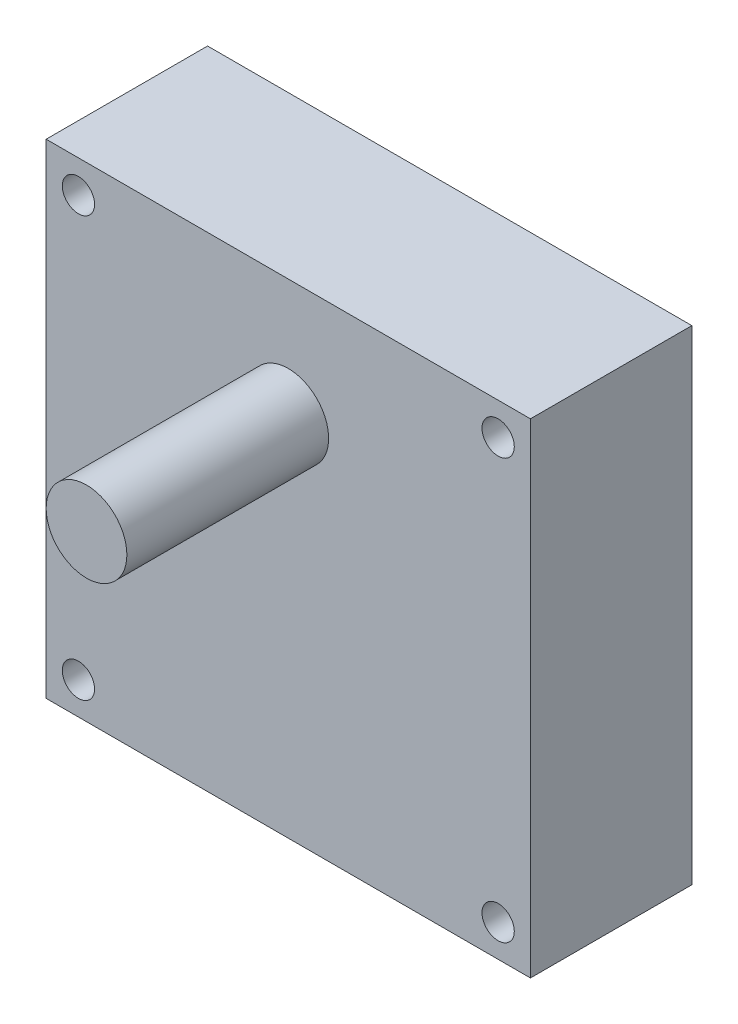
ISO-10303-21;
HEADER;
FILE_DESCRIPTION(('STEP AP214'),'2;1');
FILE_NAME('part.step','',(''),(''),'','','');
FILE_SCHEMA(('AUTOMOTIVE_DESIGN { 1 0 10303 214 1 1 1 1 }'));
ENDSEC;
DATA;
#1=APPLICATION_CONTEXT('core data for automotive mechanical design processes');
#2=APPLICATION_PROTOCOL_DEFINITION('international standard','automotive_design',2000,#1);
#3=PRODUCT_CONTEXT('',#1,'mechanical');
#4=PRODUCT('Part','Part','',(#3));
#5=PRODUCT_RELATED_PRODUCT_CATEGORY('part','',(#4));
#6=PRODUCT_DEFINITION_FORMATION('','',#4);
#7=PRODUCT_DEFINITION_CONTEXT('part definition',#1,'design');
#8=PRODUCT_DEFINITION('design','',#6,#7);
#9=PRODUCT_DEFINITION_SHAPE('','',#8);
#10=(LENGTH_UNIT() NAMED_UNIT(*) SI_UNIT(.MILLI.,.METRE.));
#11=(NAMED_UNIT(*) PLANE_ANGLE_UNIT() SI_UNIT($,.RADIAN.));
#12=(NAMED_UNIT(*) SI_UNIT($,.STERADIAN.) SOLID_ANGLE_UNIT());
#13=UNCERTAINTY_MEASURE_WITH_UNIT(LENGTH_MEASURE(1.E-05),#10,'distance_accuracy_value','');
#14=(GEOMETRIC_REPRESENTATION_CONTEXT(3) GLOBAL_UNCERTAINTY_ASSIGNED_CONTEXT((#13)) GLOBAL_UNIT_ASSIGNED_CONTEXT((#10,
#11,#12)) REPRESENTATION_CONTEXT('',''));
#15=CARTESIAN_POINT('',(0.,0.,0.));
#16=DIRECTION('',(0.,0.,1.));
#17=DIRECTION('',(1.,0.,0.));
#18=AXIS2_PLACEMENT_3D('',#15,#16,#17);
#19=CARTESIAN_POINT('',(0.,0.,20.));
#20=DIRECTION('',(-1.,0.,0.));
#21=DIRECTION('',(0.,-1.,0.));
#22=AXIS2_PLACEMENT_3D('',#19,#20,#21);
#23=PLANE('',#22);
#24=DIRECTION('',(0.,1.,0.));
#25=VECTOR('',#24,1.);
#26=CARTESIAN_POINT('',(0.,0.,0.));
#27=LINE('',#26,#25);
#28=CARTESIAN_POINT('',(0.,-60.,0.));
#29=VERTEX_POINT('',#28);
#30=CARTESIAN_POINT('',(0.,0.,0.));
#31=VERTEX_POINT('',#30);
#32=EDGE_CURVE('E100',#29,#31,#27,.T.);
#33=ORIENTED_EDGE('',*,*,#32,.T.);
#34=DIRECTION('',(0.,0.,-1.));
#35=VECTOR('',#34,1.);
#36=CARTESIAN_POINT('',(0.,0.,20.));
#37=LINE('',#36,#35);
#38=CARTESIAN_POINT('',(0.,0.,20.));
#39=VERTEX_POINT('',#38);
#40=EDGE_CURVE('E42',#39,#31,#37,.T.);
#41=ORIENTED_EDGE('',*,*,#40,.F.);
#42=DIRECTION('',(0.,1.,0.));
#43=VECTOR('',#42,1.);
#44=CARTESIAN_POINT('',(0.,0.,20.));
#45=LINE('',#44,#43);
#46=CARTESIAN_POINT('',(0.,-60.,20.));
#47=VERTEX_POINT('',#46);
#48=EDGE_CURVE('E86',#47,#39,#45,.T.);
#49=ORIENTED_EDGE('',*,*,#48,.F.);
#50=DIRECTION('',(0.,0.,-1.));
#51=VECTOR('',#50,1.);
#52=CARTESIAN_POINT('',(0.,-60.,20.));
#53=LINE('',#52,#51);
#54=EDGE_CURVE('E96',#47,#29,#53,.T.);
#55=ORIENTED_EDGE('',*,*,#54,.T.);
#56=EDGE_LOOP('',(#33,#41,#49,#55));
#57=FACE_BOUND('',#56,.T.);
#58=ADVANCED_FACE('F34',(#57),#23,.F.);
#59=CARTESIAN_POINT('',(0.,0.,20.));
#60=DIRECTION('',(0.,-1.,0.));
#61=DIRECTION('',(1.,0.,0.));
#62=AXIS2_PLACEMENT_3D('',#59,#60,#61);
#63=PLANE('',#62);
#64=DIRECTION('',(-1.,0.,0.));
#65=VECTOR('',#64,1.);
#66=CARTESIAN_POINT('',(0.,0.,0.));
#67=LINE('',#66,#65);
#68=CARTESIAN_POINT('',(-60.,0.,0.));
#69=VERTEX_POINT('',#68);
#70=EDGE_CURVE('E91',#31,#69,#67,.T.);
#71=ORIENTED_EDGE('',*,*,#70,.T.);
#72=DIRECTION('',(0.,0.,-1.));
#73=VECTOR('',#72,1.);
#74=CARTESIAN_POINT('',(-60.,0.,20.));
#75=LINE('',#74,#73);
#76=CARTESIAN_POINT('',(-60.,0.,20.));
#77=VERTEX_POINT('',#76);
#78=EDGE_CURVE('E89',#77,#69,#75,.T.);
#79=ORIENTED_EDGE('',*,*,#78,.F.);
#80=DIRECTION('',(-1.,0.,0.));
#81=VECTOR('',#80,1.);
#82=CARTESIAN_POINT('',(0.,0.,20.));
#83=LINE('',#82,#81);
#84=EDGE_CURVE('E81',#39,#77,#83,.T.);
#85=ORIENTED_EDGE('',*,*,#84,.F.);
#86=ORIENTED_EDGE('',*,*,#40,.T.);
#87=EDGE_LOOP('',(#71,#79,#85,#86));
#88=FACE_BOUND('',#87,.T.);
#89=ADVANCED_FACE('F90',(#88),#63,.F.);
#90=CARTESIAN_POINT('',(-60.,0.,20.));
#91=DIRECTION('',(1.,0.,0.));
#92=DIRECTION('',(0.,0.,-1.));
#93=AXIS2_PLACEMENT_3D('',#90,#91,#92);
#94=PLANE('',#93);
#95=DIRECTION('',(0.,-1.,0.));
#96=VECTOR('',#95,1.);
#97=CARTESIAN_POINT('',(-60.,0.,0.));
#98=LINE('',#97,#96);
#99=CARTESIAN_POINT('',(-60.,-60.,0.));
#100=VERTEX_POINT('',#99);
#101=EDGE_CURVE('E67',#69,#100,#98,.T.);
#102=ORIENTED_EDGE('',*,*,#101,.T.);
#103=DIRECTION('',(0.,0.,-1.));
#104=VECTOR('',#103,1.);
#105=CARTESIAN_POINT('',(-60.,-60.,20.));
#106=LINE('',#105,#104);
#107=CARTESIAN_POINT('',(-60.,-60.,20.));
#108=VERTEX_POINT('',#107);
#109=EDGE_CURVE('E92',#108,#100,#106,.T.);
#110=ORIENTED_EDGE('',*,*,#109,.F.);
#111=DIRECTION('',(0.,-1.,0.));
#112=VECTOR('',#111,1.);
#113=CARTESIAN_POINT('',(-60.,0.,20.));
#114=LINE('',#113,#112);
#115=EDGE_CURVE('E84',#77,#108,#114,.T.);
#116=ORIENTED_EDGE('',*,*,#115,.F.);
#117=ORIENTED_EDGE('',*,*,#78,.T.);
#118=EDGE_LOOP('',(#102,#110,#116,#117));
#119=FACE_BOUND('',#118,.T.);
#120=ADVANCED_FACE('F94',(#119),#94,.F.);
#121=CARTESIAN_POINT('',(0.,-60.,20.));
#122=DIRECTION('',(0.,1.,0.));
#123=DIRECTION('',(0.,0.,1.));
#124=AXIS2_PLACEMENT_3D('',#121,#122,#123);
#125=PLANE('',#124);
#126=DIRECTION('',(1.,0.,0.));
#127=VECTOR('',#126,1.);
#128=CARTESIAN_POINT('',(0.,-60.,0.));
#129=LINE('',#128,#127);
#130=EDGE_CURVE('E73',#100,#29,#129,.T.);
#131=ORIENTED_EDGE('',*,*,#130,.T.);
#132=ORIENTED_EDGE('',*,*,#54,.F.);
#133=DIRECTION('',(1.,0.,0.));
#134=VECTOR('',#133,1.);
#135=CARTESIAN_POINT('',(0.,-60.,20.));
#136=LINE('',#135,#134);
#137=EDGE_CURVE('E50',#108,#47,#136,.T.);
#138=ORIENTED_EDGE('',*,*,#137,.F.);
#139=ORIENTED_EDGE('',*,*,#109,.T.);
#140=EDGE_LOOP('',(#131,#132,#138,#139));
#141=FACE_BOUND('',#140,.T.);
#142=ADVANCED_FACE('F123',(#141),#125,.F.);
#143=CARTESIAN_POINT('',(0.,0.,20.));
#144=DIRECTION('',(0.,0.,-1.));
#145=DIRECTION('',(-1.,0.,0.));
#146=AXIS2_PLACEMENT_3D('',#143,#144,#145);
#147=PLANE('',#146);
#148=CARTESIAN_POINT('',(-56.,-56.,20.));
#149=DIRECTION('',(0.,0.,1.));
#150=DIRECTION('',(1.,0.,0.));
#151=AXIS2_PLACEMENT_3D('',#148,#149,#150);
#152=CIRCLE('',#151,2.);
#153=CARTESIAN_POINT('',(-54.,-56.,20.));
#154=VERTEX_POINT('',#153);
#155=EDGE_CURVE('E240',#154,#154,#152,.T.);
#156=ORIENTED_EDGE('',*,*,#155,.F.);
#157=EDGE_LOOP('',(#156));
#158=FACE_BOUND('',#157,.T.);
#159=CARTESIAN_POINT('',(-56.,-4.,20.));
#160=DIRECTION('',(0.,0.,1.));
#161=DIRECTION('',(1.,0.,0.));
#162=AXIS2_PLACEMENT_3D('',#159,#160,#161);
#163=CIRCLE('',#162,2.);
#164=CARTESIAN_POINT('',(-54.,-4.,20.));
#165=VERTEX_POINT('',#164);
#166=EDGE_CURVE('E244',#165,#165,#163,.T.);
#167=ORIENTED_EDGE('',*,*,#166,.F.);
#168=EDGE_LOOP('',(#167));
#169=FACE_BOUND('',#168,.T.);
#170=CARTESIAN_POINT('',(-3.99999999999999,-56.,20.));
#171=DIRECTION('',(0.,0.,1.));
#172=DIRECTION('',(1.,0.,0.));
#173=AXIS2_PLACEMENT_3D('',#170,#171,#172);
#174=CIRCLE('',#173,2.);
#175=CARTESIAN_POINT('',(-1.99999999999999,-56.,20.));
#176=VERTEX_POINT('',#175);
#177=EDGE_CURVE('E251',#176,#176,#174,.T.);
#178=ORIENTED_EDGE('',*,*,#177,.F.);
#179=EDGE_LOOP('',(#178));
#180=FACE_BOUND('',#179,.T.);
#181=CARTESIAN_POINT('',(-3.99999999999999,-3.99999999999999,20.));
#182=DIRECTION('',(0.,0.,1.));
#183=DIRECTION('',(1.,0.,0.));
#184=AXIS2_PLACEMENT_3D('',#181,#182,#183);
#185=CIRCLE('',#184,2.);
#186=CARTESIAN_POINT('',(-1.99999999999999,-3.99999999999999,20.));
#187=VERTEX_POINT('',#186);
#188=EDGE_CURVE('E254',#187,#187,#185,.T.);
#189=ORIENTED_EDGE('',*,*,#188,.F.);
#190=EDGE_LOOP('',(#189));
#191=FACE_BOUND('',#190,.T.);
#192=CARTESIAN_POINT('',(-30.,-14.5993622924344,20.));
#193=DIRECTION('',(0.,0.,-1.));
#194=DIRECTION('',(-1.,0.,0.));
#195=AXIS2_PLACEMENT_3D('',#192,#193,#194);
#196=CIRCLE('',#195,5.);
#197=CARTESIAN_POINT('',(-35.,-14.5993622924344,20.));
#198=VERTEX_POINT('',#197);
#199=EDGE_CURVE('E11',#198,#198,#196,.F.);
#200=ORIENTED_EDGE('',*,*,#199,.F.);
#201=EDGE_LOOP('',(#200));
#202=FACE_BOUND('',#201,.T.);
#203=ORIENTED_EDGE('',*,*,#48,.T.);
#204=ORIENTED_EDGE('',*,*,#84,.T.);
#205=ORIENTED_EDGE('',*,*,#115,.T.);
#206=ORIENTED_EDGE('',*,*,#137,.T.);
#207=EDGE_LOOP('',(#203,#204,#205,#206));
#208=FACE_BOUND('',#207,.T.);
#209=ADVANCED_FACE('F82',(#158,#169,#180,#191,#202,#208),#147,.F.);
#210=CARTESIAN_POINT('',(0.,0.,0.));
#211=DIRECTION('',(0.,0.,-1.));
#212=DIRECTION('',(-1.,0.,0.));
#213=AXIS2_PLACEMENT_3D('',#210,#211,#212);
#214=PLANE('',#213);
#215=CARTESIAN_POINT('',(-56.,-56.,0.));
#216=DIRECTION('',(0.,0.,1.));
#217=DIRECTION('',(1.,0.,0.));
#218=AXIS2_PLACEMENT_3D('',#215,#216,#217);
#219=CIRCLE('',#218,2.);
#220=CARTESIAN_POINT('',(-54.,-56.,0.));
#221=VERTEX_POINT('',#220);
#222=EDGE_CURVE('E237',#221,#221,#219,.T.);
#223=ORIENTED_EDGE('',*,*,#222,.T.);
#224=EDGE_LOOP('',(#223));
#225=FACE_BOUND('',#224,.T.);
#226=CARTESIAN_POINT('',(-56.,-4.,0.));
#227=DIRECTION('',(0.,0.,1.));
#228=DIRECTION('',(1.,0.,0.));
#229=AXIS2_PLACEMENT_3D('',#226,#227,#228);
#230=CIRCLE('',#229,2.);
#231=CARTESIAN_POINT('',(-54.,-4.,0.));
#232=VERTEX_POINT('',#231);
#233=EDGE_CURVE('E241',#232,#232,#230,.T.);
#234=ORIENTED_EDGE('',*,*,#233,.T.);
#235=EDGE_LOOP('',(#234));
#236=FACE_BOUND('',#235,.T.);
#237=CARTESIAN_POINT('',(-3.99999999999999,-56.,0.));
#238=DIRECTION('',(0.,0.,1.));
#239=DIRECTION('',(1.,0.,0.));
#240=AXIS2_PLACEMENT_3D('',#237,#238,#239);
#241=CIRCLE('',#240,2.);
#242=CARTESIAN_POINT('',(-1.99999999999999,-56.,0.));
#243=VERTEX_POINT('',#242);
#244=EDGE_CURVE('E249',#243,#243,#241,.T.);
#245=ORIENTED_EDGE('',*,*,#244,.T.);
#246=EDGE_LOOP('',(#245));
#247=FACE_BOUND('',#246,.T.);
#248=CARTESIAN_POINT('',(-3.99999999999999,-3.99999999999999,0.));
#249=DIRECTION('',(0.,0.,1.));
#250=DIRECTION('',(1.,0.,0.));
#251=AXIS2_PLACEMENT_3D('',#248,#249,#250);
#252=CIRCLE('',#251,2.);
#253=CARTESIAN_POINT('',(-1.99999999999999,-3.99999999999999,0.));
#254=VERTEX_POINT('',#253);
#255=EDGE_CURVE('E257',#254,#254,#252,.T.);
#256=ORIENTED_EDGE('',*,*,#255,.T.);
#257=EDGE_LOOP('',(#256));
#258=FACE_BOUND('',#257,.T.);
#259=ORIENTED_EDGE('',*,*,#32,.F.);
#260=ORIENTED_EDGE('',*,*,#130,.F.);
#261=ORIENTED_EDGE('',*,*,#101,.F.);
#262=ORIENTED_EDGE('',*,*,#70,.F.);
#263=EDGE_LOOP('',(#259,#260,#261,#262));
#264=FACE_BOUND('',#263,.T.);
#265=ADVANCED_FACE('F111',(#225,#236,#247,#258,#264),#214,.T.);
#266=CARTESIAN_POINT('',(-30.,-14.5993622924344,45.));
#267=DIRECTION('',(0.,0.,-1.));
#268=DIRECTION('',(-1.,0.,0.));
#269=AXIS2_PLACEMENT_3D('',#266,#267,#268);
#270=CYLINDRICAL_SURFACE('',#269,5.);
#271=CARTESIAN_POINT('',(-30.,-14.5993622924344,45.));
#272=DIRECTION('',(0.,0.,1.));
#273=DIRECTION('',(1.,0.,0.));
#274=AXIS2_PLACEMENT_3D('',#271,#272,#273);
#275=CIRCLE('',#274,5.);
#276=CARTESIAN_POINT('',(-25.,-14.5993622924344,45.));
#277=VERTEX_POINT('',#276);
#278=EDGE_CURVE('E103',#277,#277,#275,.T.);
#279=ORIENTED_EDGE('',*,*,#278,.F.);
#280=EDGE_LOOP('',(#279));
#281=FACE_BOUND('',#280,.T.);
#282=ORIENTED_EDGE('',*,*,#199,.T.);
#283=EDGE_LOOP('',(#282));
#284=FACE_BOUND('',#283,.T.);
#285=ADVANCED_FACE('F113',(#281,#284),#270,.T.);
#286=CARTESIAN_POINT('',(-30.,-14.5993622924344,45.));
#287=DIRECTION('',(0.,0.,1.));
#288=DIRECTION('',(1.,0.,0.));
#289=AXIS2_PLACEMENT_3D('',#286,#287,#288);
#290=PLANE('',#289);
#291=ORIENTED_EDGE('',*,*,#278,.T.);
#292=EDGE_LOOP('',(#291));
#293=FACE_BOUND('',#292,.T.);
#294=ADVANCED_FACE('F120',(#293),#290,.T.);
#295=CARTESIAN_POINT('',(-3.99999999999999,-3.99999999999999,0.));
#296=DIRECTION('',(0.,0.,1.));
#297=DIRECTION('',(1.,0.,0.));
#298=AXIS2_PLACEMENT_3D('',#295,#296,#297);
#299=CYLINDRICAL_SURFACE('',#298,2.);
#300=ORIENTED_EDGE('',*,*,#255,.F.);
#301=EDGE_LOOP('',(#300));
#302=FACE_BOUND('',#301,.T.);
#303=ORIENTED_EDGE('',*,*,#188,.T.);
#304=EDGE_LOOP('',(#303));
#305=FACE_BOUND('',#304,.T.);
#306=ADVANCED_FACE('F192',(#302,#305),#299,.F.);
#307=CARTESIAN_POINT('',(-3.99999999999999,-56.,0.));
#308=DIRECTION('',(0.,0.,1.));
#309=DIRECTION('',(1.,0.,0.));
#310=AXIS2_PLACEMENT_3D('',#307,#308,#309);
#311=CYLINDRICAL_SURFACE('',#310,2.);
#312=ORIENTED_EDGE('',*,*,#244,.F.);
#313=EDGE_LOOP('',(#312));
#314=FACE_BOUND('',#313,.T.);
#315=ORIENTED_EDGE('',*,*,#177,.T.);
#316=EDGE_LOOP('',(#315));
#317=FACE_BOUND('',#316,.T.);
#318=ADVANCED_FACE('F200',(#314,#317),#311,.F.);
#319=CARTESIAN_POINT('',(-56.,-4.,0.));
#320=DIRECTION('',(0.,0.,1.));
#321=DIRECTION('',(1.,0.,0.));
#322=AXIS2_PLACEMENT_3D('',#319,#320,#321);
#323=CYLINDRICAL_SURFACE('',#322,2.);
#324=ORIENTED_EDGE('',*,*,#233,.F.);
#325=EDGE_LOOP('',(#324));
#326=FACE_BOUND('',#325,.T.);
#327=ORIENTED_EDGE('',*,*,#166,.T.);
#328=EDGE_LOOP('',(#327));
#329=FACE_BOUND('',#328,.T.);
#330=ADVANCED_FACE('F209',(#326,#329),#323,.F.);
#331=CARTESIAN_POINT('',(-56.,-56.,0.));
#332=DIRECTION('',(0.,0.,1.));
#333=DIRECTION('',(1.,0.,0.));
#334=AXIS2_PLACEMENT_3D('',#331,#332,#333);
#335=CYLINDRICAL_SURFACE('',#334,2.);
#336=ORIENTED_EDGE('',*,*,#222,.F.);
#337=EDGE_LOOP('',(#336));
#338=FACE_BOUND('',#337,.T.);
#339=ORIENTED_EDGE('',*,*,#155,.T.);
#340=EDGE_LOOP('',(#339));
#341=FACE_BOUND('',#340,.T.);
#342=ADVANCED_FACE('F218',(#338,#341),#335,.F.);
#343=CLOSED_SHELL('',(#58,#89,#120,#142,#209,#265,#285,#294,#306,#318,#330,#342));
#344=MANIFOLD_SOLID_BREP('B2',#343);
#345=ADVANCED_BREP_SHAPE_REPRESENTATION('',(#18,#344),#14);
#346=SHAPE_DEFINITION_REPRESENTATION(#9,#345);
ENDSEC;
END-ISO-10303-21;
